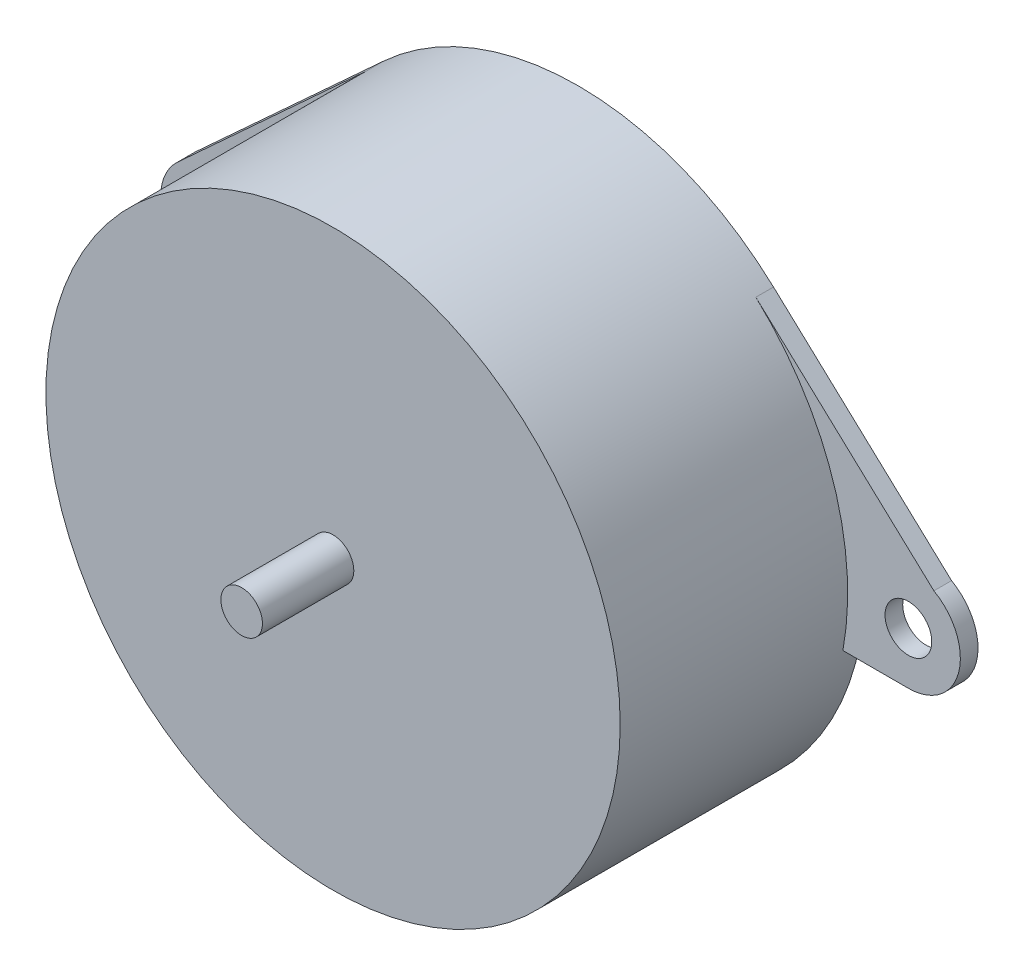
ISO-10303-21;
HEADER;
FILE_DESCRIPTION(('STEP AP214'),'2;1');
FILE_NAME('part.step','',(''),(''),'','','');
FILE_SCHEMA(('AUTOMOTIVE_DESIGN { 1 0 10303 214 1 1 1 1 }'));
ENDSEC;
DATA;
#1=APPLICATION_CONTEXT('core data for automotive mechanical design processes');
#2=APPLICATION_PROTOCOL_DEFINITION('international standard','automotive_design',2000,#1);
#3=PRODUCT_CONTEXT('',#1,'mechanical');
#4=PRODUCT('Part','Part','',(#3));
#5=PRODUCT_RELATED_PRODUCT_CATEGORY('part','',(#4));
#6=PRODUCT_DEFINITION_FORMATION('','',#4);
#7=PRODUCT_DEFINITION_CONTEXT('part definition',#1,'design');
#8=PRODUCT_DEFINITION('design','',#6,#7);
#9=PRODUCT_DEFINITION_SHAPE('','',#8);
#10=(LENGTH_UNIT() NAMED_UNIT(*) SI_UNIT(.MILLI.,.METRE.));
#11=(NAMED_UNIT(*) PLANE_ANGLE_UNIT() SI_UNIT($,.RADIAN.));
#12=(NAMED_UNIT(*) SI_UNIT($,.STERADIAN.) SOLID_ANGLE_UNIT());
#13=UNCERTAINTY_MEASURE_WITH_UNIT(LENGTH_MEASURE(1.E-05),#10,'distance_accuracy_value','');
#14=(GEOMETRIC_REPRESENTATION_CONTEXT(3) GLOBAL_UNCERTAINTY_ASSIGNED_CONTEXT((#13)) GLOBAL_UNIT_ASSIGNED_CONTEXT((#10,
#11,#12)) REPRESENTATION_CONTEXT('',''));
#15=CARTESIAN_POINT('',(0.,0.,0.));
#16=DIRECTION('',(0.,0.,1.));
#17=DIRECTION('',(1.,0.,0.));
#18=AXIS2_PLACEMENT_3D('',#15,#16,#17);
#19=CARTESIAN_POINT('',(0.,0.,-1.7));
#20=DIRECTION('',(0.,0.,-1.));
#21=DIRECTION('',(-1.,0.,0.));
#22=AXIS2_PLACEMENT_3D('',#19,#20,#21);
#23=PLANE('',#22);
#24=CARTESIAN_POINT('',(33.5,0.,-1.7));
#25=DIRECTION('',(0.,0.,-1.));
#26=DIRECTION('',(-1.,0.,0.));
#27=AXIS2_PLACEMENT_3D('',#24,#25,#26);
#28=CIRCLE('',#27,2.25);
#29=CARTESIAN_POINT('',(31.25,0.,-1.7));
#30=VERTEX_POINT('',#29);
#31=EDGE_CURVE('E133',#30,#30,#28,.T.);
#32=ORIENTED_EDGE('',*,*,#31,.F.);
#33=EDGE_LOOP('',(#32));
#34=FACE_BOUND('',#33,.T.);
#35=CARTESIAN_POINT('',(-33.5,0.,-1.7));
#36=DIRECTION('',(0.,0.,-1.));
#37=DIRECTION('',(-1.,0.,0.));
#38=AXIS2_PLACEMENT_3D('',#35,#36,#37);
#39=CIRCLE('',#38,2.25);
#40=CARTESIAN_POINT('',(-35.75,0.,-1.7));
#41=VERTEX_POINT('',#40);
#42=EDGE_CURVE('E126',#41,#41,#39,.T.);
#43=ORIENTED_EDGE('',*,*,#42,.F.);
#44=EDGE_LOOP('',(#43));
#45=FACE_BOUND('',#44,.T.);
#46=DIRECTION('',(0.736792068976795,0.676119402985075,0.));
#47=VECTOR('',#46,1.);
#48=CARTESIAN_POINT('',(-18.6947014925373,20.3723007072084,-1.7));
#49=LINE('',#48,#47);
#50=CARTESIAN_POINT('',(-36.8805970149254,3.68396034488397,-1.7));
#51=VERTEX_POINT('',#50);
#52=CARTESIAN_POINT('',(-18.6947014925373,20.3723007072084,-1.7));
#53=VERTEX_POINT('',#52);
#54=EDGE_CURVE('E157',#51,#53,#49,.T.);
#55=ORIENTED_EDGE('',*,*,#54,.T.);
#56=CARTESIAN_POINT('',(0.,0.,-1.7));
#57=DIRECTION('',(0.,0.,-1.));
#58=DIRECTION('',(-1.,0.,0.));
#59=AXIS2_PLACEMENT_3D('',#56,#57,#58);
#60=CIRCLE('',#59,27.65);
#61=CARTESIAN_POINT('',(18.8079172397411,20.2678254655759,-1.7));
#62=VERTEX_POINT('',#61);
#63=EDGE_CURVE('E96',#53,#62,#60,.T.);
#64=ORIENTED_EDGE('',*,*,#63,.T.);
#65=DIRECTION('',(-0.73301357922517,0.680214005053929,0.));
#66=VECTOR('',#65,1.);
#67=CARTESIAN_POINT('',(18.8079172397411,20.2678254655759,-1.7));
#68=LINE('',#67,#66);
#69=CARTESIAN_POINT('',(35.9551740020576,4.35569978529516,-1.7));
#70=VERTEX_POINT('',#69);
#71=EDGE_CURVE('E270',#70,#62,#68,.T.);
#72=ORIENTED_EDGE('',*,*,#71,.F.);
#73=CARTESIAN_POINT('',(33.5,0.,-1.7));
#74=DIRECTION('',(0.,0.,-1.));
#75=DIRECTION('',(-1.,0.,0.));
#76=AXIS2_PLACEMENT_3D('',#73,#74,#75);
#77=CIRCLE('',#76,5.);
#78=CARTESIAN_POINT('',(33.5,-5.00000000000001,-1.7));
#79=VERTEX_POINT('',#78);
#80=EDGE_CURVE('E272',#70,#79,#77,.T.);
#81=ORIENTED_EDGE('',*,*,#80,.T.);
#82=DIRECTION('',(-1.,0.,0.));
#83=VECTOR('',#82,1.);
#84=CARTESIAN_POINT('',(0.,-4.99999999999992,-1.7));
#85=LINE('',#84,#83);
#86=CARTESIAN_POINT('',(27.1941629766389,-5.,-1.7));
#87=VERTEX_POINT('',#86);
#88=EDGE_CURVE('E114',#79,#87,#85,.T.);
#89=ORIENTED_EDGE('',*,*,#88,.T.);
#90=CARTESIAN_POINT('',(-27.1941629766389,-5.,-1.7));
#91=VERTEX_POINT('',#90);
#92=EDGE_CURVE('E108',#87,#91,#60,.T.);
#93=ORIENTED_EDGE('',*,*,#92,.T.);
#94=DIRECTION('',(1.,0.,0.));
#95=VECTOR('',#94,1.);
#96=CARTESIAN_POINT('',(0.,-4.99999999999998,-1.7));
#97=LINE('',#96,#95);
#98=CARTESIAN_POINT('',(-33.5,-5.,-1.7));
#99=VERTEX_POINT('',#98);
#100=EDGE_CURVE('E112',#99,#91,#97,.T.);
#101=ORIENTED_EDGE('',*,*,#100,.F.);
#102=CARTESIAN_POINT('',(-33.5,0.,-1.7));
#103=DIRECTION('',(0.,0.,-1.));
#104=DIRECTION('',(-1.,0.,0.));
#105=AXIS2_PLACEMENT_3D('',#102,#103,#104);
#106=CIRCLE('',#105,5.);
#107=EDGE_CURVE('E59',#99,#51,#106,.T.);
#108=ORIENTED_EDGE('',*,*,#107,.T.);
#109=EDGE_LOOP('',(#55,#64,#72,#81,#89,#93,#101,#108));
#110=FACE_BOUND('',#109,.T.);
#111=CARTESIAN_POINT('',(0.,0.,-1.7));
#112=DIRECTION('',(0.,0.,-1.));
#113=DIRECTION('',(-1.,0.,0.));
#114=AXIS2_PLACEMENT_3D('',#111,#112,#113);
#115=CIRCLE('',#114,5.55);
#116=CARTESIAN_POINT('',(-5.55,0.,-1.7));
#117=VERTEX_POINT('',#116);
#118=EDGE_CURVE('E264',#117,#117,#115,.T.);
#119=ORIENTED_EDGE('',*,*,#118,.F.);
#120=EDGE_LOOP('',(#119));
#121=FACE_BOUND('',#120,.T.);
#122=ADVANCED_FACE('F35',(#34,#45,#110,#121),#23,.T.);
#123=CARTESIAN_POINT('',(0.,0.,21.9));
#124=DIRECTION('',(0.,0.,-1.));
#125=DIRECTION('',(-1.,0.,0.));
#126=AXIS2_PLACEMENT_3D('',#123,#124,#125);
#127=CYLINDRICAL_SURFACE('',#126,27.65);
#128=CARTESIAN_POINT('',(0.,0.,21.9));
#129=DIRECTION('',(0.,0.,1.));
#130=DIRECTION('',(1.,0.,0.));
#131=AXIS2_PLACEMENT_3D('',#128,#129,#130);
#132=CIRCLE('',#131,27.65);
#133=CARTESIAN_POINT('',(27.65,0.,21.9));
#134=VERTEX_POINT('',#133);
#135=EDGE_CURVE('E178',#134,#134,#132,.T.);
#136=ORIENTED_EDGE('',*,*,#135,.F.);
#137=EDGE_LOOP('',(#136));
#138=FACE_BOUND('',#137,.T.);
#139=CARTESIAN_POINT('',(0.,0.,0.));
#140=DIRECTION('',(0.,0.,-1.));
#141=DIRECTION('',(-1.,0.,0.));
#142=AXIS2_PLACEMENT_3D('',#139,#140,#141);
#143=CIRCLE('',#142,27.65);
#144=CARTESIAN_POINT('',(18.8079172397411,20.2678254655759,0.));
#145=VERTEX_POINT('',#144);
#146=CARTESIAN_POINT('',(27.1941629766389,-5.,0.));
#147=VERTEX_POINT('',#146);
#148=EDGE_CURVE('E171',#145,#147,#143,.T.);
#149=ORIENTED_EDGE('',*,*,#148,.F.);
#150=DIRECTION('',(0.,0.,1.));
#151=VECTOR('',#150,1.);
#152=CARTESIAN_POINT('',(18.8079172397411,20.2678254655759,-1.7));
#153=LINE('',#152,#151);
#154=EDGE_CURVE('E166',#62,#145,#153,.T.);
#155=ORIENTED_EDGE('',*,*,#154,.F.);
#156=ORIENTED_EDGE('',*,*,#63,.F.);
#157=DIRECTION('',(0.,0.,1.));
#158=VECTOR('',#157,1.);
#159=CARTESIAN_POINT('',(-18.6947014925373,20.3723007072084,-1.7));
#160=LINE('',#159,#158);
#161=CARTESIAN_POINT('',(-18.6947014925373,20.3723007072084,0.));
#162=VERTEX_POINT('',#161);
#163=EDGE_CURVE('E168',#53,#162,#160,.T.);
#164=ORIENTED_EDGE('',*,*,#163,.T.);
#165=CARTESIAN_POINT('',(-27.1941629766389,-5.,0.));
#166=VERTEX_POINT('',#165);
#167=EDGE_CURVE('E118',#166,#162,#143,.T.);
#168=ORIENTED_EDGE('',*,*,#167,.F.);
#169=DIRECTION('',(0.,0.,1.));
#170=VECTOR('',#169,1.);
#171=CARTESIAN_POINT('',(-27.1941629766389,-5.,-1.7));
#172=LINE('',#171,#170);
#173=EDGE_CURVE('E117',#91,#166,#172,.T.);
#174=ORIENTED_EDGE('',*,*,#173,.F.);
#175=ORIENTED_EDGE('',*,*,#92,.F.);
#176=DIRECTION('',(0.,0.,1.));
#177=VECTOR('',#176,1.);
#178=CARTESIAN_POINT('',(27.1941629766389,-5.,-1.7));
#179=LINE('',#178,#177);
#180=EDGE_CURVE('E50',#87,#147,#179,.T.);
#181=ORIENTED_EDGE('',*,*,#180,.T.);
#182=EDGE_LOOP('',(#149,#155,#156,#164,#168,#174,#175,#181));
#183=FACE_BOUND('',#182,.T.);
#184=ADVANCED_FACE('F37',(#138,#183),#127,.T.);
#185=CARTESIAN_POINT('',(0.,0.,21.9));
#186=DIRECTION('',(0.,0.,1.));
#187=DIRECTION('',(1.,0.,0.));
#188=AXIS2_PLACEMENT_3D('',#185,#186,#187);
#189=PLANE('',#188);
#190=CARTESIAN_POINT('',(0.,0.,21.9));
#191=DIRECTION('',(0.,0.,1.));
#192=DIRECTION('',(1.,0.,0.));
#193=AXIS2_PLACEMENT_3D('',#190,#191,#192);
#194=CIRCLE('',#193,2.);
#195=CARTESIAN_POINT('',(2.,0.,21.9));
#196=VERTEX_POINT('',#195);
#197=EDGE_CURVE('E43',#196,#196,#194,.T.);
#198=ORIENTED_EDGE('',*,*,#197,.F.);
#199=EDGE_LOOP('',(#198));
#200=FACE_BOUND('',#199,.T.);
#201=ORIENTED_EDGE('',*,*,#135,.T.);
#202=EDGE_LOOP('',(#201));
#203=FACE_BOUND('',#202,.T.);
#204=ADVANCED_FACE('F183',(#200,#203),#189,.T.);
#205=CARTESIAN_POINT('',(0.,0.,-12.1));
#206=DIRECTION('',(0.,0.,1.));
#207=DIRECTION('',(1.,0.,0.));
#208=AXIS2_PLACEMENT_3D('',#205,#206,#207);
#209=CYLINDRICAL_SURFACE('',#208,2.);
#210=ORIENTED_EDGE('',*,*,#197,.T.);
#211=EDGE_LOOP('',(#210));
#212=FACE_BOUND('',#211,.T.);
#213=CARTESIAN_POINT('',(0.,0.,30.7));
#214=DIRECTION('',(0.,0.,1.));
#215=DIRECTION('',(1.,0.,0.));
#216=AXIS2_PLACEMENT_3D('',#213,#214,#215);
#217=CIRCLE('',#216,2.);
#218=CARTESIAN_POINT('',(2.,0.,30.7));
#219=VERTEX_POINT('',#218);
#220=EDGE_CURVE('E172',#219,#219,#217,.T.);
#221=ORIENTED_EDGE('',*,*,#220,.F.);
#222=EDGE_LOOP('',(#221));
#223=FACE_BOUND('',#222,.T.);
#224=ADVANCED_FACE('F190',(#212,#223),#209,.T.);
#225=CARTESIAN_POINT('',(0.,0.,30.7));
#226=DIRECTION('',(0.,0.,1.));
#227=DIRECTION('',(1.,0.,0.));
#228=AXIS2_PLACEMENT_3D('',#225,#226,#227);
#229=PLANE('',#228);
#230=ORIENTED_EDGE('',*,*,#220,.T.);
#231=EDGE_LOOP('',(#230));
#232=FACE_BOUND('',#231,.T.);
#233=ADVANCED_FACE('F206',(#232),#229,.T.);
#234=CARTESIAN_POINT('',(0.,0.,0.));
#235=DIRECTION('',(0.,0.,-1.));
#236=DIRECTION('',(-1.,0.,0.));
#237=AXIS2_PLACEMENT_3D('',#234,#235,#236);
#238=PLANE('',#237);
#239=CARTESIAN_POINT('',(33.5,0.,0.));
#240=DIRECTION('',(0.,0.,-1.));
#241=DIRECTION('',(-1.,0.,0.));
#242=AXIS2_PLACEMENT_3D('',#239,#240,#241);
#243=CIRCLE('',#242,2.25);
#244=CARTESIAN_POINT('',(31.25,0.,0.));
#245=VERTEX_POINT('',#244);
#246=EDGE_CURVE('E154',#245,#245,#243,.T.);
#247=ORIENTED_EDGE('',*,*,#246,.T.);
#248=EDGE_LOOP('',(#247));
#249=FACE_BOUND('',#248,.T.);
#250=DIRECTION('',(-0.73301357922517,0.680214005053929,0.));
#251=VECTOR('',#250,1.);
#252=CARTESIAN_POINT('',(18.8079172397411,20.2678254655759,0.));
#253=LINE('',#252,#251);
#254=CARTESIAN_POINT('',(35.9551740020576,4.35569978529516,0.));
#255=VERTEX_POINT('',#254);
#256=EDGE_CURVE('E140',#255,#145,#253,.T.);
#257=ORIENTED_EDGE('',*,*,#256,.T.);
#258=ORIENTED_EDGE('',*,*,#148,.T.);
#259=DIRECTION('',(-1.,0.,0.));
#260=VECTOR('',#259,1.);
#261=CARTESIAN_POINT('',(0.,-4.99999999999992,0.));
#262=LINE('',#261,#260);
#263=CARTESIAN_POINT('',(33.5,-5.00000000000001,0.));
#264=VERTEX_POINT('',#263);
#265=EDGE_CURVE('E146',#264,#147,#262,.T.);
#266=ORIENTED_EDGE('',*,*,#265,.F.);
#267=CARTESIAN_POINT('',(33.5,0.,0.));
#268=DIRECTION('',(0.,0.,-1.));
#269=DIRECTION('',(-1.,0.,0.));
#270=AXIS2_PLACEMENT_3D('',#267,#268,#269);
#271=CIRCLE('',#270,5.);
#272=EDGE_CURVE('E144',#255,#264,#271,.T.);
#273=ORIENTED_EDGE('',*,*,#272,.F.);
#274=EDGE_LOOP('',(#257,#258,#266,#273));
#275=FACE_BOUND('',#274,.T.);
#276=ADVANCED_FACE('F202',(#249,#275),#238,.F.);
#277=CARTESIAN_POINT('',(-33.5,0.,0.));
#278=DIRECTION('',(0.,0.,-1.));
#279=DIRECTION('',(-1.,0.,0.));
#280=AXIS2_PLACEMENT_3D('',#277,#278,#279);
#281=CIRCLE('',#280,2.25);
#282=CARTESIAN_POINT('',(-35.75,0.,0.));
#283=VERTEX_POINT('',#282);
#284=EDGE_CURVE('E151',#283,#283,#281,.T.);
#285=ORIENTED_EDGE('',*,*,#284,.T.);
#286=EDGE_LOOP('',(#285));
#287=FACE_BOUND('',#286,.T.);
#288=DIRECTION('',(1.,0.,0.));
#289=VECTOR('',#288,1.);
#290=CARTESIAN_POINT('',(0.,-4.99999999999998,0.));
#291=LINE('',#290,#289);
#292=CARTESIAN_POINT('',(-33.5,-5.,0.));
#293=VERTEX_POINT('',#292);
#294=EDGE_CURVE('E148',#293,#166,#291,.T.);
#295=ORIENTED_EDGE('',*,*,#294,.T.);
#296=ORIENTED_EDGE('',*,*,#167,.T.);
#297=DIRECTION('',(0.736792068976795,0.676119402985075,0.));
#298=VECTOR('',#297,1.);
#299=CARTESIAN_POINT('',(-18.6947014925373,20.3723007072084,0.));
#300=LINE('',#299,#298);
#301=CARTESIAN_POINT('',(-36.8805970149254,3.68396034488397,0.));
#302=VERTEX_POINT('',#301);
#303=EDGE_CURVE('E137',#302,#162,#300,.T.);
#304=ORIENTED_EDGE('',*,*,#303,.F.);
#305=CARTESIAN_POINT('',(-33.5,0.,0.));
#306=DIRECTION('',(0.,0.,-1.));
#307=DIRECTION('',(-1.,0.,0.));
#308=AXIS2_PLACEMENT_3D('',#305,#306,#307);
#309=CIRCLE('',#308,5.);
#310=EDGE_CURVE('E88',#293,#302,#309,.T.);
#311=ORIENTED_EDGE('',*,*,#310,.F.);
#312=EDGE_LOOP('',(#295,#296,#304,#311));
#313=FACE_BOUND('',#312,.T.);
#314=ADVANCED_FACE('F205',(#287,#313),#238,.F.);
#315=CARTESIAN_POINT('',(-18.6947014925373,20.3723007072084,-1.7));
#316=DIRECTION('',(0.676119402985075,-0.736792068976795,0.));
#317=DIRECTION('',(0.736792068976795,0.676119402985075,0.));
#318=AXIS2_PLACEMENT_3D('',#315,#316,#317);
#319=PLANE('',#318);
#320=ORIENTED_EDGE('',*,*,#303,.T.);
#321=ORIENTED_EDGE('',*,*,#163,.F.);
#322=ORIENTED_EDGE('',*,*,#54,.F.);
#323=DIRECTION('',(0.,0.,1.));
#324=VECTOR('',#323,1.);
#325=CARTESIAN_POINT('',(-36.8805970149254,3.68396034488397,-1.7));
#326=LINE('',#325,#324);
#327=EDGE_CURVE('E136',#51,#302,#326,.T.);
#328=ORIENTED_EDGE('',*,*,#327,.T.);
#329=EDGE_LOOP('',(#320,#321,#322,#328));
#330=FACE_BOUND('',#329,.T.);
#331=ADVANCED_FACE('F232',(#330),#319,.F.);
#332=CARTESIAN_POINT('',(18.8079172397411,20.2678254655759,-1.7));
#333=DIRECTION('',(0.680214005053929,0.73301357922517,0.));
#334=DIRECTION('',(-0.73301357922517,0.680214005053929,0.));
#335=AXIS2_PLACEMENT_3D('',#332,#333,#334);
#336=PLANE('',#335);
#337=ORIENTED_EDGE('',*,*,#256,.F.);
#338=DIRECTION('',(0.,0.,1.));
#339=VECTOR('',#338,1.);
#340=CARTESIAN_POINT('',(35.9551740020576,4.35569978529516,-1.7));
#341=LINE('',#340,#339);
#342=EDGE_CURVE('E164',#70,#255,#341,.T.);
#343=ORIENTED_EDGE('',*,*,#342,.F.);
#344=ORIENTED_EDGE('',*,*,#71,.T.);
#345=ORIENTED_EDGE('',*,*,#154,.T.);
#346=EDGE_LOOP('',(#337,#343,#344,#345));
#347=FACE_BOUND('',#346,.T.);
#348=ADVANCED_FACE('F228',(#347),#336,.T.);
#349=CARTESIAN_POINT('',(33.5,0.,-1.7));
#350=DIRECTION('',(0.,0.,1.));
#351=DIRECTION('',(1.,0.,0.));
#352=AXIS2_PLACEMENT_3D('',#349,#350,#351);
#353=CYLINDRICAL_SURFACE('',#352,5.);
#354=ORIENTED_EDGE('',*,*,#272,.T.);
#355=DIRECTION('',(0.,0.,1.));
#356=VECTOR('',#355,1.);
#357=CARTESIAN_POINT('',(33.5,-5.00000000000001,-1.7));
#358=LINE('',#357,#356);
#359=EDGE_CURVE('E161',#79,#264,#358,.T.);
#360=ORIENTED_EDGE('',*,*,#359,.F.);
#361=ORIENTED_EDGE('',*,*,#80,.F.);
#362=ORIENTED_EDGE('',*,*,#342,.T.);
#363=EDGE_LOOP('',(#354,#360,#361,#362));
#364=FACE_BOUND('',#363,.T.);
#365=ADVANCED_FACE('F224',(#364),#353,.T.);
#366=CARTESIAN_POINT('',(0.,-4.99999999999992,-1.7));
#367=DIRECTION('',(0.,1.,0.));
#368=DIRECTION('',(-1.,0.,0.));
#369=AXIS2_PLACEMENT_3D('',#366,#367,#368);
#370=PLANE('',#369);
#371=ORIENTED_EDGE('',*,*,#265,.T.);
#372=ORIENTED_EDGE('',*,*,#180,.F.);
#373=ORIENTED_EDGE('',*,*,#88,.F.);
#374=ORIENTED_EDGE('',*,*,#359,.T.);
#375=EDGE_LOOP('',(#371,#372,#373,#374));
#376=FACE_BOUND('',#375,.T.);
#377=ADVANCED_FACE('F221',(#376),#370,.F.);
#378=CARTESIAN_POINT('',(0.,-4.99999999999998,-1.7));
#379=DIRECTION('',(0.,-1.,0.));
#380=DIRECTION('',(1.,0.,0.));
#381=AXIS2_PLACEMENT_3D('',#378,#379,#380);
#382=PLANE('',#381);
#383=ORIENTED_EDGE('',*,*,#294,.F.);
#384=DIRECTION('',(0.,0.,1.));
#385=VECTOR('',#384,1.);
#386=CARTESIAN_POINT('',(-33.5,-5.,-1.7));
#387=LINE('',#386,#385);
#388=EDGE_CURVE('E122',#99,#293,#387,.T.);
#389=ORIENTED_EDGE('',*,*,#388,.F.);
#390=ORIENTED_EDGE('',*,*,#100,.T.);
#391=ORIENTED_EDGE('',*,*,#173,.T.);
#392=EDGE_LOOP('',(#383,#389,#390,#391));
#393=FACE_BOUND('',#392,.T.);
#394=ADVANCED_FACE('F124',(#393),#382,.T.);
#395=CARTESIAN_POINT('',(-33.5,0.,-1.7));
#396=DIRECTION('',(0.,0.,1.));
#397=DIRECTION('',(1.,0.,0.));
#398=AXIS2_PLACEMENT_3D('',#395,#396,#397);
#399=CYLINDRICAL_SURFACE('',#398,2.25);
#400=ORIENTED_EDGE('',*,*,#42,.T.);
#401=EDGE_LOOP('',(#400));
#402=FACE_BOUND('',#401,.T.);
#403=ORIENTED_EDGE('',*,*,#284,.F.);
#404=EDGE_LOOP('',(#403));
#405=FACE_BOUND('',#404,.T.);
#406=ADVANCED_FACE('F213',(#402,#405),#399,.F.);
#407=CARTESIAN_POINT('',(-33.5,0.,-1.7));
#408=DIRECTION('',(0.,0.,1.));
#409=DIRECTION('',(1.,0.,0.));
#410=AXIS2_PLACEMENT_3D('',#407,#408,#409);
#411=CYLINDRICAL_SURFACE('',#410,5.);
#412=ORIENTED_EDGE('',*,*,#310,.T.);
#413=ORIENTED_EDGE('',*,*,#327,.F.);
#414=ORIENTED_EDGE('',*,*,#107,.F.);
#415=ORIENTED_EDGE('',*,*,#388,.T.);
#416=EDGE_LOOP('',(#412,#413,#414,#415));
#417=FACE_BOUND('',#416,.T.);
#418=ADVANCED_FACE('F211',(#417),#411,.T.);
#419=CARTESIAN_POINT('',(33.5,0.,-1.7));
#420=DIRECTION('',(0.,0.,1.));
#421=DIRECTION('',(1.,0.,0.));
#422=AXIS2_PLACEMENT_3D('',#419,#420,#421);
#423=CYLINDRICAL_SURFACE('',#422,2.25);
#424=ORIENTED_EDGE('',*,*,#31,.T.);
#425=EDGE_LOOP('',(#424));
#426=FACE_BOUND('',#425,.T.);
#427=ORIENTED_EDGE('',*,*,#246,.F.);
#428=EDGE_LOOP('',(#427));
#429=FACE_BOUND('',#428,.T.);
#430=ADVANCED_FACE('F208',(#426,#429),#423,.F.);
#431=CARTESIAN_POINT('',(0.,0.,-3.7));
#432=DIRECTION('',(0.,0.,1.));
#433=DIRECTION('',(1.,0.,0.));
#434=AXIS2_PLACEMENT_3D('',#431,#432,#433);
#435=CYLINDRICAL_SURFACE('',#434,5.55);
#436=CARTESIAN_POINT('',(0.,0.,-3.7));
#437=DIRECTION('',(0.,0.,-1.));
#438=DIRECTION('',(-1.,0.,0.));
#439=AXIS2_PLACEMENT_3D('',#436,#437,#438);
#440=CIRCLE('',#439,5.55);
#441=CARTESIAN_POINT('',(-5.55,0.,-3.7));
#442=VERTEX_POINT('',#441);
#443=EDGE_CURVE('E141',#442,#442,#440,.T.);
#444=ORIENTED_EDGE('',*,*,#443,.F.);
#445=EDGE_LOOP('',(#444));
#446=FACE_BOUND('',#445,.T.);
#447=ORIENTED_EDGE('',*,*,#118,.T.);
#448=EDGE_LOOP('',(#447));
#449=FACE_BOUND('',#448,.T.);
#450=ADVANCED_FACE('F200',(#446,#449),#435,.T.);
#451=CARTESIAN_POINT('',(0.,0.,-3.7));
#452=DIRECTION('',(0.,0.,-1.));
#453=DIRECTION('',(-1.,0.,0.));
#454=AXIS2_PLACEMENT_3D('',#451,#452,#453);
#455=PLANE('',#454);
#456=CARTESIAN_POINT('',(0.,0.,-3.7));
#457=DIRECTION('',(0.,0.,-1.));
#458=DIRECTION('',(-1.,0.,0.));
#459=AXIS2_PLACEMENT_3D('',#456,#457,#458);
#460=CIRCLE('',#459,2.);
#461=CARTESIAN_POINT('',(-2.,0.,-3.7));
#462=VERTEX_POINT('',#461);
#463=EDGE_CURVE('E11',#462,#462,#460,.F.);
#464=ORIENTED_EDGE('',*,*,#463,.T.);
#465=EDGE_LOOP('',(#464));
#466=FACE_BOUND('',#465,.T.);
#467=ORIENTED_EDGE('',*,*,#443,.T.);
#468=EDGE_LOOP('',(#467));
#469=FACE_BOUND('',#468,.T.);
#470=ADVANCED_FACE('F244',(#466,#469),#455,.T.);
#471=CARTESIAN_POINT('',(0.,0.,-12.1));
#472=DIRECTION('',(0.,0.,1.));
#473=DIRECTION('',(1.,0.,0.));
#474=AXIS2_PLACEMENT_3D('',#471,#472,#473);
#475=PLANE('',#474);
#476=CARTESIAN_POINT('',(0.,0.,-12.1));
#477=DIRECTION('',(0.,0.,1.));
#478=DIRECTION('',(1.,0.,0.));
#479=AXIS2_PLACEMENT_3D('',#476,#477,#478);
#480=CIRCLE('',#479,2.);
#481=CARTESIAN_POINT('',(2.,0.,-12.1));
#482=VERTEX_POINT('',#481);
#483=EDGE_CURVE('E175',#482,#482,#480,.T.);
#484=ORIENTED_EDGE('',*,*,#483,.F.);
#485=EDGE_LOOP('',(#484));
#486=FACE_BOUND('',#485,.T.);
#487=ADVANCED_FACE('F240',(#486),#475,.F.);
#488=ORIENTED_EDGE('',*,*,#463,.F.);
#489=EDGE_LOOP('',(#488));
#490=FACE_BOUND('',#489,.T.);
#491=ORIENTED_EDGE('',*,*,#483,.T.);
#492=EDGE_LOOP('',(#491));
#493=FACE_BOUND('',#492,.T.);
#494=ADVANCED_FACE('F243',(#490,#493),#209,.T.);
#495=CLOSED_SHELL('',(#122,#184,#204,#224,#233,#276,#314,#331,#348,#365,#377,#394,#406,#418,
#430,#450,#470,#487,#494));
#496=MANIFOLD_SOLID_BREP('B2',#495);
#497=ADVANCED_BREP_SHAPE_REPRESENTATION('',(#18,#496),#14);
#498=SHAPE_DEFINITION_REPRESENTATION(#9,#497);
ENDSEC;
END-ISO-10303-21;
